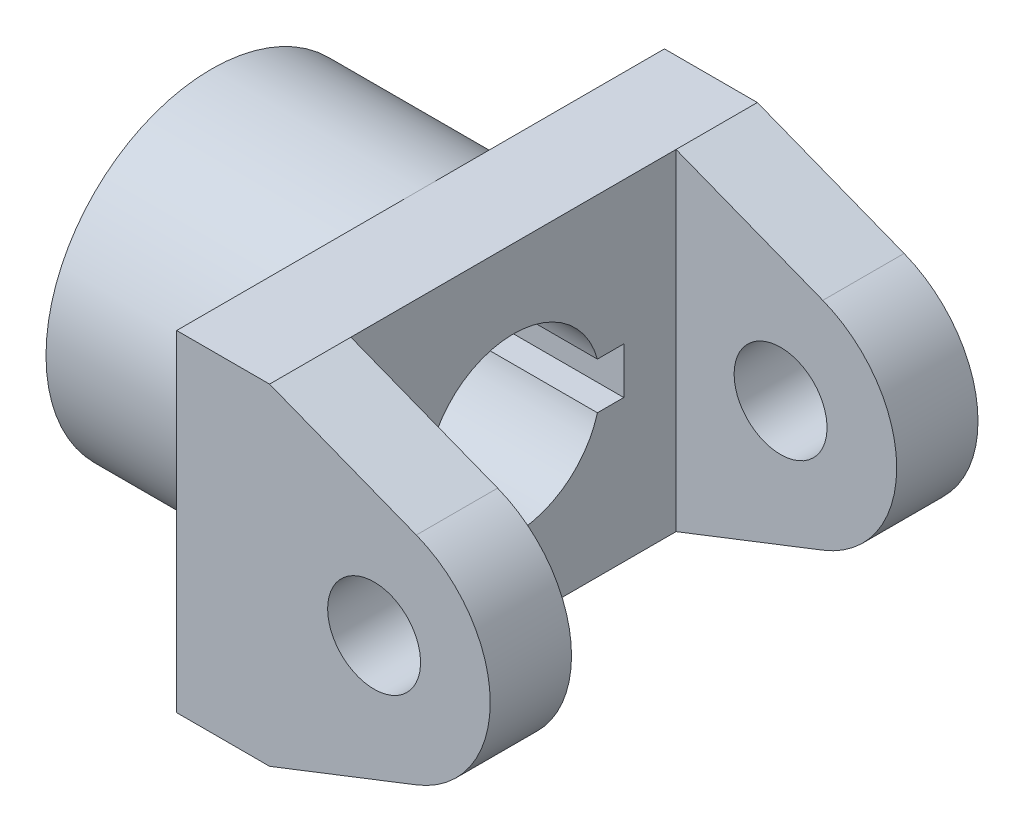
ISO-10303-21;
HEADER;
FILE_DESCRIPTION(('STEP AP214'),'2;1');
FILE_NAME('part.step','',(''),(''),'','','');
FILE_SCHEMA(('AUTOMOTIVE_DESIGN { 1 0 10303 214 1 1 1 1 }'));
ENDSEC;
DATA;
#1=APPLICATION_CONTEXT('core data for automotive mechanical design processes');
#2=APPLICATION_PROTOCOL_DEFINITION('international standard','automotive_design',2000,#1);
#3=PRODUCT_CONTEXT('',#1,'mechanical');
#4=PRODUCT('Part','Part','',(#3));
#5=PRODUCT_RELATED_PRODUCT_CATEGORY('part','',(#4));
#6=PRODUCT_DEFINITION_FORMATION('','',#4);
#7=PRODUCT_DEFINITION_CONTEXT('part definition',#1,'design');
#8=PRODUCT_DEFINITION('design','',#6,#7);
#9=PRODUCT_DEFINITION_SHAPE('','',#8);
#10=(LENGTH_UNIT() NAMED_UNIT(*) SI_UNIT(.MILLI.,.METRE.));
#11=(NAMED_UNIT(*) PLANE_ANGLE_UNIT() SI_UNIT($,.RADIAN.));
#12=(NAMED_UNIT(*) SI_UNIT($,.STERADIAN.) SOLID_ANGLE_UNIT());
#13=UNCERTAINTY_MEASURE_WITH_UNIT(LENGTH_MEASURE(1.E-05),#10,'distance_accuracy_value','');
#14=(GEOMETRIC_REPRESENTATION_CONTEXT(3) GLOBAL_UNCERTAINTY_ASSIGNED_CONTEXT((#13)) GLOBAL_UNIT_ASSIGNED_CONTEXT((#10,
#11,#12)) REPRESENTATION_CONTEXT('',''));
#15=CARTESIAN_POINT('',(0.,0.,0.));
#16=DIRECTION('',(0.,0.,1.));
#17=DIRECTION('',(1.,0.,0.));
#18=AXIS2_PLACEMENT_3D('',#15,#16,#17);
#19=CARTESIAN_POINT('',(-8.,28.5,42.));
#20=DIRECTION('',(1.,0.,0.));
#21=DIRECTION('',(0.,1.,0.));
#22=AXIS2_PLACEMENT_3D('',#19,#20,#21);
#23=PLANE('',#22);
#24=CARTESIAN_POINT('',(-8.,0.,0.));
#25=DIRECTION('',(-1.,0.,0.));
#26=DIRECTION('',(0.,-1.,0.));
#27=AXIS2_PLACEMENT_3D('',#24,#25,#26);
#28=CIRCLE('',#27,28.5);
#29=CARTESIAN_POINT('',(-7.99999999999999,-28.5,0.));
#30=VERTEX_POINT('',#29);
#31=CARTESIAN_POINT('',(-8.,28.5,0.));
#32=VERTEX_POINT('',#31);
#33=EDGE_CURVE('E177',#30,#32,#28,.T.);
#34=ORIENTED_EDGE('',*,*,#33,.F.);
#35=DIRECTION('',(0.,0.,-1.));
#36=VECTOR('',#35,1.);
#37=CARTESIAN_POINT('',(-7.99999999999999,-28.5,42.));
#38=LINE('',#37,#36);
#39=CARTESIAN_POINT('',(-7.99999999999999,-28.5,42.));
#40=VERTEX_POINT('',#39);
#41=EDGE_CURVE('E268',#40,#30,#38,.T.);
#42=ORIENTED_EDGE('',*,*,#41,.F.);
#43=DIRECTION('',(0.,-1.,0.));
#44=VECTOR('',#43,1.);
#45=CARTESIAN_POINT('',(-8.,28.5,42.));
#46=LINE('',#45,#44);
#47=CARTESIAN_POINT('',(-8.,28.5,42.));
#48=VERTEX_POINT('',#47);
#49=EDGE_CURVE('E251',#48,#40,#46,.T.);
#50=ORIENTED_EDGE('',*,*,#49,.F.);
#51=DIRECTION('',(0.,0.,-1.));
#52=VECTOR('',#51,1.);
#53=CARTESIAN_POINT('',(-8.,28.5,42.));
#54=LINE('',#53,#52);
#55=EDGE_CURVE('E271',#48,#32,#54,.T.);
#56=ORIENTED_EDGE('',*,*,#55,.T.);
#57=EDGE_LOOP('',(#34,#42,#50,#56));
#58=FACE_BOUND('',#57,.T.);
#59=ADVANCED_FACE('F41',(#58),#23,.F.);
#60=CARTESIAN_POINT('',(8.,28.5,42.));
#61=DIRECTION('',(-1.,0.,0.));
#62=DIRECTION('',(0.,-1.,0.));
#63=AXIS2_PLACEMENT_3D('',#60,#61,#62);
#64=PLANE('',#63);
#65=DIRECTION('',(0.,-1.,0.));
#66=VECTOR('',#65,1.);
#67=CARTESIAN_POINT('',(8.,28.5,-19.));
#68=LINE('',#67,#66);
#69=CARTESIAN_POINT('',(8.00000000000002,4.,-19.));
#70=VERTEX_POINT('',#69);
#71=CARTESIAN_POINT('',(8.00000000000002,-4.,-19.));
#72=VERTEX_POINT('',#71);
#73=EDGE_CURVE('E150',#70,#72,#68,.T.);
#74=ORIENTED_EDGE('',*,*,#73,.T.);
#75=DIRECTION('',(0.,0.,1.));
#76=VECTOR('',#75,1.);
#77=CARTESIAN_POINT('',(8.,-4.,42.));
#78=LINE('',#77,#76);
#79=CARTESIAN_POINT('',(8.00000000000001,-4.,-14.456832294801));
#80=VERTEX_POINT('',#79);
#81=EDGE_CURVE('E159',#72,#80,#78,.T.);
#82=ORIENTED_EDGE('',*,*,#81,.T.);
#83=CARTESIAN_POINT('',(8.,0.,0.));
#84=DIRECTION('',(-1.,0.,0.));
#85=DIRECTION('',(0.,-1.,0.));
#86=AXIS2_PLACEMENT_3D('',#83,#84,#85);
#87=CIRCLE('',#86,15.);
#88=CARTESIAN_POINT('',(8.,4.,-14.456832294801));
#89=VERTEX_POINT('',#88);
#90=EDGE_CURVE('E158',#80,#89,#87,.T.);
#91=ORIENTED_EDGE('',*,*,#90,.T.);
#92=DIRECTION('',(0.,0.,-1.));
#93=VECTOR('',#92,1.);
#94=CARTESIAN_POINT('',(8.,4.,42.));
#95=LINE('',#94,#93);
#96=EDGE_CURVE('E56',#89,#70,#95,.T.);
#97=ORIENTED_EDGE('',*,*,#96,.T.);
#98=EDGE_LOOP('',(#74,#82,#91,#97));
#99=FACE_BOUND('',#98,.T.);
#100=DIRECTION('',(0.,-1.,0.));
#101=VECTOR('',#100,1.);
#102=CARTESIAN_POINT('',(8.,0.,28.));
#103=LINE('',#102,#101);
#104=CARTESIAN_POINT('',(8.,28.5,28.));
#105=VERTEX_POINT('',#104);
#106=CARTESIAN_POINT('',(8.00000000000001,-28.5,28.));
#107=VERTEX_POINT('',#106);
#108=EDGE_CURVE('E191',#105,#107,#103,.T.);
#109=ORIENTED_EDGE('',*,*,#108,.T.);
#110=DIRECTION('',(0.,0.,-1.));
#111=VECTOR('',#110,1.);
#112=CARTESIAN_POINT('',(8.00000000000001,-28.5,42.));
#113=LINE('',#112,#111);
#114=CARTESIAN_POINT('',(8.00000000000001,-28.5,-28.));
#115=VERTEX_POINT('',#114);
#116=EDGE_CURVE('E257',#107,#115,#113,.T.);
#117=ORIENTED_EDGE('',*,*,#116,.T.);
#118=DIRECTION('',(0.,-1.,0.));
#119=VECTOR('',#118,1.);
#120=CARTESIAN_POINT('',(8.,0.,-28.));
#121=LINE('',#120,#119);
#122=CARTESIAN_POINT('',(8.,28.5,-28.));
#123=VERTEX_POINT('',#122);
#124=EDGE_CURVE('E226',#123,#115,#121,.T.);
#125=ORIENTED_EDGE('',*,*,#124,.F.);
#126=DIRECTION('',(0.,0.,-1.));
#127=VECTOR('',#126,1.);
#128=CARTESIAN_POINT('',(8.,28.5,42.));
#129=LINE('',#128,#127);
#130=EDGE_CURVE('E274',#105,#123,#129,.T.);
#131=ORIENTED_EDGE('',*,*,#130,.F.);
#132=EDGE_LOOP('',(#109,#117,#125,#131));
#133=FACE_BOUND('',#132,.T.);
#134=ADVANCED_FACE('F43',(#99,#133),#64,.F.);
#135=CARTESIAN_POINT('',(-8.,28.5,42.));
#136=DIRECTION('',(0.,-1.,0.));
#137=DIRECTION('',(0.,0.,-1.));
#138=AXIS2_PLACEMENT_3D('',#135,#136,#137);
#139=PLANE('',#138);
#140=DIRECTION('',(-1.,0.,0.));
#141=VECTOR('',#140,1.);
#142=CARTESIAN_POINT('',(-8.,28.5,-42.));
#143=LINE('',#142,#141);
#144=CARTESIAN_POINT('',(8.,28.5,-42.));
#145=VERTEX_POINT('',#144);
#146=CARTESIAN_POINT('',(-8.,28.5,-42.));
#147=VERTEX_POINT('',#146);
#148=EDGE_CURVE('E242',#145,#147,#143,.T.);
#149=ORIENTED_EDGE('',*,*,#148,.T.);
#150=EDGE_CURVE('E270',#32,#147,#54,.T.);
#151=ORIENTED_EDGE('',*,*,#150,.F.);
#152=ORIENTED_EDGE('',*,*,#55,.F.);
#153=DIRECTION('',(-1.,0.,0.));
#154=VECTOR('',#153,1.);
#155=CARTESIAN_POINT('',(-8.,28.5,42.));
#156=LINE('',#155,#154);
#157=CARTESIAN_POINT('',(8.,28.5,42.));
#158=VERTEX_POINT('',#157);
#159=EDGE_CURVE('E249',#158,#48,#156,.T.);
#160=ORIENTED_EDGE('',*,*,#159,.F.);
#161=EDGE_CURVE('E275',#158,#105,#129,.T.);
#162=ORIENTED_EDGE('',*,*,#161,.T.);
#163=ORIENTED_EDGE('',*,*,#130,.T.);
#164=DIRECTION('',(0.,0.,-1.));
#165=VECTOR('',#164,1.);
#166=CARTESIAN_POINT('',(8.,28.5,-28.));
#167=LINE('',#166,#165);
#168=EDGE_CURVE('E240',#123,#145,#167,.T.);
#169=ORIENTED_EDGE('',*,*,#168,.T.);
#170=EDGE_LOOP('',(#149,#151,#152,#160,#162,#163,#169));
#171=FACE_BOUND('',#170,.T.);
#172=ADVANCED_FACE('F308',(#171),#139,.F.);
#173=EDGE_CURVE('E64',#32,#30,#28,.T.);
#174=ORIENTED_EDGE('',*,*,#173,.F.);
#175=ORIENTED_EDGE('',*,*,#150,.T.);
#176=DIRECTION('',(0.,-1.,0.));
#177=VECTOR('',#176,1.);
#178=CARTESIAN_POINT('',(-8.,28.5,-42.));
#179=LINE('',#178,#177);
#180=CARTESIAN_POINT('',(-7.99999999999999,-28.5,-42.));
#181=VERTEX_POINT('',#180);
#182=EDGE_CURVE('E260',#147,#181,#179,.T.);
#183=ORIENTED_EDGE('',*,*,#182,.T.);
#184=EDGE_CURVE('E267',#30,#181,#38,.T.);
#185=ORIENTED_EDGE('',*,*,#184,.F.);
#186=EDGE_LOOP('',(#174,#175,#183,#185));
#187=FACE_BOUND('',#186,.T.);
#188=ADVANCED_FACE('F311',(#187),#23,.F.);
#189=CARTESIAN_POINT('',(-7.99999999999999,-28.5,42.));
#190=DIRECTION('',(0.,1.,0.));
#191=DIRECTION('',(0.,0.,1.));
#192=AXIS2_PLACEMENT_3D('',#189,#190,#191);
#193=PLANE('',#192);
#194=DIRECTION('',(1.,0.,0.));
#195=VECTOR('',#194,1.);
#196=CARTESIAN_POINT('',(-7.99999999999999,-28.5,-42.));
#197=LINE('',#196,#195);
#198=CARTESIAN_POINT('',(8.00000000000001,-28.5,-42.));
#199=VERTEX_POINT('',#198);
#200=EDGE_CURVE('E252',#181,#199,#197,.T.);
#201=ORIENTED_EDGE('',*,*,#200,.T.);
#202=DIRECTION('',(0.,0.,-1.));
#203=VECTOR('',#202,1.);
#204=CARTESIAN_POINT('',(8.00000000000001,-28.5,-28.));
#205=LINE('',#204,#203);
#206=EDGE_CURVE('E243',#115,#199,#205,.T.);
#207=ORIENTED_EDGE('',*,*,#206,.F.);
#208=ORIENTED_EDGE('',*,*,#116,.F.);
#209=CARTESIAN_POINT('',(8.00000000000001,-28.5,42.));
#210=VERTEX_POINT('',#209);
#211=EDGE_CURVE('E264',#210,#107,#113,.T.);
#212=ORIENTED_EDGE('',*,*,#211,.F.);
#213=DIRECTION('',(1.,0.,0.));
#214=VECTOR('',#213,1.);
#215=CARTESIAN_POINT('',(-7.99999999999999,-28.5,42.));
#216=LINE('',#215,#214);
#217=EDGE_CURVE('E254',#40,#210,#216,.T.);
#218=ORIENTED_EDGE('',*,*,#217,.F.);
#219=ORIENTED_EDGE('',*,*,#41,.T.);
#220=ORIENTED_EDGE('',*,*,#184,.T.);
#221=EDGE_LOOP('',(#201,#207,#208,#212,#218,#219,#220));
#222=FACE_BOUND('',#221,.T.);
#223=ADVANCED_FACE('F319',(#222),#193,.F.);
#224=CARTESIAN_POINT('',(0.,0.,42.));
#225=DIRECTION('',(0.,0.,1.));
#226=DIRECTION('',(1.,0.,0.));
#227=AXIS2_PLACEMENT_3D('',#224,#225,#226);
#228=PLANE('',#227);
#229=ORIENTED_EDGE('',*,*,#217,.T.);
#230=DIRECTION('',(-0.931494554757971,-0.363755267255677,0.));
#231=VECTOR('',#230,1.);
#232=CARTESIAN_POINT('',(10.715370600976,-27.4396284137025,42.));
#233=LINE('',#232,#231);
#234=CARTESIAN_POINT('',(33.2751053451135,-18.6298910951594,42.));
#235=VERTEX_POINT('',#234);
#236=EDGE_CURVE('E204',#235,#210,#233,.T.);
#237=ORIENTED_EDGE('',*,*,#236,.F.);
#238=CARTESIAN_POINT('',(26.,0.,42.));
#239=DIRECTION('',(0.,0.,-1.));
#240=DIRECTION('',(-1.,0.,0.));
#241=AXIS2_PLACEMENT_3D('',#238,#239,#240);
#242=CIRCLE('',#241,20.);
#243=CARTESIAN_POINT('',(33.2751053451135,18.6298910951594,42.));
#244=VERTEX_POINT('',#243);
#245=EDGE_CURVE('E188',#244,#235,#242,.T.);
#246=ORIENTED_EDGE('',*,*,#245,.F.);
#247=DIRECTION('',(-0.931494554757971,0.363755267255677,0.));
#248=VECTOR('',#247,1.);
#249=CARTESIAN_POINT('',(10.715370600976,27.4396284137025,42.));
#250=LINE('',#249,#248);
#251=EDGE_CURVE('E202',#244,#158,#250,.T.);
#252=ORIENTED_EDGE('',*,*,#251,.T.);
#253=ORIENTED_EDGE('',*,*,#159,.T.);
#254=ORIENTED_EDGE('',*,*,#49,.T.);
#255=EDGE_LOOP('',(#229,#237,#246,#252,#253,#254));
#256=FACE_BOUND('',#255,.T.);
#257=CARTESIAN_POINT('',(26.,0.,42.));
#258=DIRECTION('',(0.,0.,-1.));
#259=DIRECTION('',(-1.,0.,0.));
#260=AXIS2_PLACEMENT_3D('',#257,#258,#259);
#261=CIRCLE('',#260,8.);
#262=CARTESIAN_POINT('',(18.,0.,42.));
#263=VERTEX_POINT('',#262);
#264=EDGE_CURVE('E181',#263,#263,#261,.T.);
#265=ORIENTED_EDGE('',*,*,#264,.T.);
#266=EDGE_LOOP('',(#265));
#267=FACE_BOUND('',#266,.T.);
#268=ADVANCED_FACE('F344',(#256,#267),#228,.T.);
#269=CARTESIAN_POINT('',(0.,0.,-42.));
#270=DIRECTION('',(0.,0.,1.));
#271=DIRECTION('',(1.,0.,0.));
#272=AXIS2_PLACEMENT_3D('',#269,#270,#271);
#273=PLANE('',#272);
#274=ORIENTED_EDGE('',*,*,#148,.F.);
#275=DIRECTION('',(-0.931494554757971,0.363755267255677,0.));
#276=VECTOR('',#275,1.);
#277=CARTESIAN_POINT('',(10.715370600976,27.4396284137025,-42.));
#278=LINE('',#277,#276);
#279=CARTESIAN_POINT('',(33.2751053451135,18.6298910951594,-42.));
#280=VERTEX_POINT('',#279);
#281=EDGE_CURVE('E232',#280,#145,#278,.T.);
#282=ORIENTED_EDGE('',*,*,#281,.F.);
#283=CARTESIAN_POINT('',(26.,0.,-42.));
#284=DIRECTION('',(0.,0.,-1.));
#285=DIRECTION('',(-1.,0.,0.));
#286=AXIS2_PLACEMENT_3D('',#283,#284,#285);
#287=CIRCLE('',#286,20.);
#288=CARTESIAN_POINT('',(33.2751053451135,-18.6298910951594,-42.));
#289=VERTEX_POINT('',#288);
#290=EDGE_CURVE('E235',#280,#289,#287,.T.);
#291=ORIENTED_EDGE('',*,*,#290,.T.);
#292=DIRECTION('',(-0.931494554757971,-0.363755267255677,0.));
#293=VECTOR('',#292,1.);
#294=CARTESIAN_POINT('',(10.715370600976,-27.4396284137025,-42.));
#295=LINE('',#294,#293);
#296=EDGE_CURVE('E217',#289,#199,#295,.T.);
#297=ORIENTED_EDGE('',*,*,#296,.T.);
#298=ORIENTED_EDGE('',*,*,#200,.F.);
#299=ORIENTED_EDGE('',*,*,#182,.F.);
#300=EDGE_LOOP('',(#274,#282,#291,#297,#298,#299));
#301=FACE_BOUND('',#300,.T.);
#302=CARTESIAN_POINT('',(26.,0.,-42.));
#303=DIRECTION('',(0.,0.,-1.));
#304=DIRECTION('',(-1.,0.,0.));
#305=AXIS2_PLACEMENT_3D('',#302,#303,#304);
#306=CIRCLE('',#305,8.);
#307=CARTESIAN_POINT('',(18.,0.,-42.));
#308=VERTEX_POINT('',#307);
#309=EDGE_CURVE('E210',#308,#308,#306,.T.);
#310=ORIENTED_EDGE('',*,*,#309,.F.);
#311=EDGE_LOOP('',(#310));
#312=FACE_BOUND('',#311,.T.);
#313=ADVANCED_FACE('F314',(#301,#312),#273,.F.);
#314=CARTESIAN_POINT('',(10.715370600976,27.4396284137025,-28.));
#315=DIRECTION('',(-0.363755267255677,-0.931494554757971,0.));
#316=DIRECTION('',(0.931494554757971,-0.363755267255677,0.));
#317=AXIS2_PLACEMENT_3D('',#314,#315,#316);
#318=PLANE('',#317);
#319=ORIENTED_EDGE('',*,*,#281,.T.);
#320=ORIENTED_EDGE('',*,*,#168,.F.);
#321=DIRECTION('',(-0.931494554757971,0.363755267255677,0.));
#322=VECTOR('',#321,1.);
#323=CARTESIAN_POINT('',(10.715370600976,27.4396284137025,-28.));
#324=LINE('',#323,#322);
#325=CARTESIAN_POINT('',(33.2751053451135,18.6298910951594,-28.));
#326=VERTEX_POINT('',#325);
#327=EDGE_CURVE('E216',#326,#123,#324,.T.);
#328=ORIENTED_EDGE('',*,*,#327,.F.);
#329=DIRECTION('',(0.,0.,-1.));
#330=VECTOR('',#329,1.);
#331=CARTESIAN_POINT('',(33.2751053451135,18.6298910951594,-28.));
#332=LINE('',#331,#330);
#333=EDGE_CURVE('E229',#326,#280,#332,.T.);
#334=ORIENTED_EDGE('',*,*,#333,.T.);
#335=EDGE_LOOP('',(#319,#320,#328,#334));
#336=FACE_BOUND('',#335,.T.);
#337=ADVANCED_FACE('F335',(#336),#318,.F.);
#338=CARTESIAN_POINT('',(10.715370600976,-27.4396284137025,-28.));
#339=DIRECTION('',(0.363755267255677,-0.931494554757971,0.));
#340=DIRECTION('',(0.931494554757971,0.363755267255677,0.));
#341=AXIS2_PLACEMENT_3D('',#338,#339,#340);
#342=PLANE('',#341);
#343=ORIENTED_EDGE('',*,*,#296,.F.);
#344=DIRECTION('',(0.,0.,-1.));
#345=VECTOR('',#344,1.);
#346=CARTESIAN_POINT('',(33.2751053451135,-18.6298910951594,-28.));
#347=LINE('',#346,#345);
#348=CARTESIAN_POINT('',(33.2751053451135,-18.6298910951594,-28.));
#349=VERTEX_POINT('',#348);
#350=EDGE_CURVE('E246',#349,#289,#347,.T.);
#351=ORIENTED_EDGE('',*,*,#350,.F.);
#352=DIRECTION('',(-0.931494554757971,-0.363755267255677,0.));
#353=VECTOR('',#352,1.);
#354=CARTESIAN_POINT('',(10.715370600976,-27.4396284137025,-28.));
#355=LINE('',#354,#353);
#356=EDGE_CURVE('E223',#349,#115,#355,.T.);
#357=ORIENTED_EDGE('',*,*,#356,.T.);
#358=ORIENTED_EDGE('',*,*,#206,.T.);
#359=EDGE_LOOP('',(#343,#351,#357,#358));
#360=FACE_BOUND('',#359,.T.);
#361=ADVANCED_FACE('F322',(#360),#342,.T.);
#362=CARTESIAN_POINT('',(26.,0.,-28.));
#363=DIRECTION('',(0.,0.,-1.));
#364=DIRECTION('',(-1.,0.,0.));
#365=AXIS2_PLACEMENT_3D('',#362,#363,#364);
#366=CYLINDRICAL_SURFACE('',#365,8.);
#367=CARTESIAN_POINT('',(26.,0.,-28.));
#368=DIRECTION('',(0.,0.,-1.));
#369=DIRECTION('',(-1.,0.,0.));
#370=AXIS2_PLACEMENT_3D('',#367,#368,#369);
#371=CIRCLE('',#370,8.);
#372=CARTESIAN_POINT('',(18.,0.,-28.));
#373=VERTEX_POINT('',#372);
#374=EDGE_CURVE('E213',#373,#373,#371,.T.);
#375=ORIENTED_EDGE('',*,*,#374,.F.);
#376=EDGE_LOOP('',(#375));
#377=FACE_BOUND('',#376,.T.);
#378=ORIENTED_EDGE('',*,*,#309,.T.);
#379=EDGE_LOOP('',(#378));
#380=FACE_BOUND('',#379,.T.);
#381=ADVANCED_FACE('F448',(#377,#380),#366,.F.);
#382=CARTESIAN_POINT('',(26.,0.,-28.));
#383=DIRECTION('',(0.,0.,-1.));
#384=DIRECTION('',(-1.,0.,0.));
#385=AXIS2_PLACEMENT_3D('',#382,#383,#384);
#386=CYLINDRICAL_SURFACE('',#385,20.);
#387=ORIENTED_EDGE('',*,*,#290,.F.);
#388=ORIENTED_EDGE('',*,*,#333,.F.);
#389=CARTESIAN_POINT('',(26.,0.,-28.));
#390=DIRECTION('',(0.,0.,-1.));
#391=DIRECTION('',(-1.,0.,0.));
#392=AXIS2_PLACEMENT_3D('',#389,#390,#391);
#393=CIRCLE('',#392,20.);
#394=EDGE_CURVE('E220',#326,#349,#393,.T.);
#395=ORIENTED_EDGE('',*,*,#394,.T.);
#396=ORIENTED_EDGE('',*,*,#350,.T.);
#397=EDGE_LOOP('',(#387,#388,#395,#396));
#398=FACE_BOUND('',#397,.T.);
#399=ADVANCED_FACE('F330',(#398),#386,.T.);
#400=CARTESIAN_POINT('',(0.,0.,-28.));
#401=DIRECTION('',(0.,0.,-1.));
#402=DIRECTION('',(-1.,0.,0.));
#403=AXIS2_PLACEMENT_3D('',#400,#401,#402);
#404=PLANE('',#403);
#405=ORIENTED_EDGE('',*,*,#374,.T.);
#406=EDGE_LOOP('',(#405));
#407=FACE_BOUND('',#406,.T.);
#408=ORIENTED_EDGE('',*,*,#327,.T.);
#409=ORIENTED_EDGE('',*,*,#124,.T.);
#410=ORIENTED_EDGE('',*,*,#356,.F.);
#411=ORIENTED_EDGE('',*,*,#394,.F.);
#412=EDGE_LOOP('',(#408,#409,#410,#411));
#413=FACE_BOUND('',#412,.T.);
#414=ADVANCED_FACE('F326',(#407,#413),#404,.F.);
#415=CARTESIAN_POINT('',(10.715370600976,27.4396284137025,28.));
#416=DIRECTION('',(0.363755267255677,0.931494554757971,0.));
#417=DIRECTION('',(-0.931494554757971,0.363755267255677,0.));
#418=AXIS2_PLACEMENT_3D('',#415,#416,#417);
#419=PLANE('',#418);
#420=ORIENTED_EDGE('',*,*,#251,.F.);
#421=DIRECTION('',(0.,0.,1.));
#422=VECTOR('',#421,1.);
#423=CARTESIAN_POINT('',(33.2751053451135,18.6298910951594,28.));
#424=LINE('',#423,#422);
#425=CARTESIAN_POINT('',(33.2751053451135,18.6298910951594,28.));
#426=VERTEX_POINT('',#425);
#427=EDGE_CURVE('E208',#426,#244,#424,.T.);
#428=ORIENTED_EDGE('',*,*,#427,.F.);
#429=DIRECTION('',(-0.931494554757971,0.363755267255677,0.));
#430=VECTOR('',#429,1.);
#431=CARTESIAN_POINT('',(10.715370600976,27.4396284137025,28.));
#432=LINE('',#431,#430);
#433=EDGE_CURVE('E187',#426,#105,#432,.T.);
#434=ORIENTED_EDGE('',*,*,#433,.T.);
#435=ORIENTED_EDGE('',*,*,#161,.F.);
#436=EDGE_LOOP('',(#420,#428,#434,#435));
#437=FACE_BOUND('',#436,.T.);
#438=ADVANCED_FACE('F348',(#437),#419,.T.);
#439=CARTESIAN_POINT('',(26.,0.,28.));
#440=DIRECTION('',(0.,0.,1.));
#441=DIRECTION('',(1.,0.,0.));
#442=AXIS2_PLACEMENT_3D('',#439,#440,#441);
#443=CYLINDRICAL_SURFACE('',#442,20.);
#444=ORIENTED_EDGE('',*,*,#245,.T.);
#445=DIRECTION('',(0.,0.,1.));
#446=VECTOR('',#445,1.);
#447=CARTESIAN_POINT('',(33.2751053451135,-18.6298910951594,28.));
#448=LINE('',#447,#446);
#449=CARTESIAN_POINT('',(33.2751053451135,-18.6298910951594,28.));
#450=VERTEX_POINT('',#449);
#451=EDGE_CURVE('E199',#450,#235,#448,.T.);
#452=ORIENTED_EDGE('',*,*,#451,.F.);
#453=CARTESIAN_POINT('',(26.,0.,28.));
#454=DIRECTION('',(0.,0.,-1.));
#455=DIRECTION('',(-1.,0.,0.));
#456=AXIS2_PLACEMENT_3D('',#453,#454,#455);
#457=CIRCLE('',#456,20.);
#458=EDGE_CURVE('E196',#426,#450,#457,.T.);
#459=ORIENTED_EDGE('',*,*,#458,.F.);
#460=ORIENTED_EDGE('',*,*,#427,.T.);
#461=EDGE_LOOP('',(#444,#452,#459,#460));
#462=FACE_BOUND('',#461,.T.);
#463=ADVANCED_FACE('F353',(#462),#443,.T.);
#464=CARTESIAN_POINT('',(10.715370600976,-27.4396284137025,28.));
#465=DIRECTION('',(-0.363755267255677,0.931494554757971,0.));
#466=DIRECTION('',(-0.931494554757971,-0.363755267255677,0.));
#467=AXIS2_PLACEMENT_3D('',#464,#465,#466);
#468=PLANE('',#467);
#469=ORIENTED_EDGE('',*,*,#236,.T.);
#470=ORIENTED_EDGE('',*,*,#211,.T.);
#471=DIRECTION('',(-0.931494554757971,-0.363755267255677,0.));
#472=VECTOR('',#471,1.);
#473=CARTESIAN_POINT('',(10.715370600976,-27.4396284137025,28.));
#474=LINE('',#473,#472);
#475=EDGE_CURVE('E194',#450,#107,#474,.T.);
#476=ORIENTED_EDGE('',*,*,#475,.F.);
#477=ORIENTED_EDGE('',*,*,#451,.T.);
#478=EDGE_LOOP('',(#469,#470,#476,#477));
#479=FACE_BOUND('',#478,.T.);
#480=ADVANCED_FACE('F340',(#479),#468,.F.);
#481=CARTESIAN_POINT('',(26.,0.,28.));
#482=DIRECTION('',(0.,0.,1.));
#483=DIRECTION('',(1.,0.,0.));
#484=AXIS2_PLACEMENT_3D('',#481,#482,#483);
#485=CYLINDRICAL_SURFACE('',#484,8.);
#486=CARTESIAN_POINT('',(26.,0.,28.));
#487=DIRECTION('',(0.,0.,-1.));
#488=DIRECTION('',(-1.,0.,0.));
#489=AXIS2_PLACEMENT_3D('',#486,#487,#488);
#490=CIRCLE('',#489,8.);
#491=CARTESIAN_POINT('',(18.,0.,28.));
#492=VERTEX_POINT('',#491);
#493=EDGE_CURVE('E184',#492,#492,#490,.T.);
#494=ORIENTED_EDGE('',*,*,#493,.T.);
#495=EDGE_LOOP('',(#494));
#496=FACE_BOUND('',#495,.T.);
#497=ORIENTED_EDGE('',*,*,#264,.F.);
#498=EDGE_LOOP('',(#497));
#499=FACE_BOUND('',#498,.T.);
#500=ADVANCED_FACE('F360',(#496,#499),#485,.F.);
#501=CARTESIAN_POINT('',(0.,0.,28.));
#502=DIRECTION('',(0.,0.,1.));
#503=DIRECTION('',(-1.,0.,0.));
#504=AXIS2_PLACEMENT_3D('',#501,#502,#503);
#505=PLANE('',#504);
#506=ORIENTED_EDGE('',*,*,#493,.F.);
#507=EDGE_LOOP('',(#506));
#508=FACE_BOUND('',#507,.T.);
#509=ORIENTED_EDGE('',*,*,#433,.F.);
#510=ORIENTED_EDGE('',*,*,#458,.T.);
#511=ORIENTED_EDGE('',*,*,#475,.T.);
#512=ORIENTED_EDGE('',*,*,#108,.F.);
#513=EDGE_LOOP('',(#509,#510,#511,#512));
#514=FACE_BOUND('',#513,.T.);
#515=ADVANCED_FACE('F293',(#508,#514),#505,.F.);
#516=CARTESIAN_POINT('',(-44.,0.,0.));
#517=DIRECTION('',(-1.,0.,0.));
#518=DIRECTION('',(0.,-1.,0.));
#519=AXIS2_PLACEMENT_3D('',#516,#517,#518);
#520=PLANE('',#519);
#521=DIRECTION('',(0.,0.,1.));
#522=VECTOR('',#521,1.);
#523=CARTESIAN_POINT('',(-44.,-4.,0.));
#524=LINE('',#523,#522);
#525=CARTESIAN_POINT('',(-44.,-4.,-19.));
#526=VERTEX_POINT('',#525);
#527=CARTESIAN_POINT('',(-44.,-4.,-14.456832294801));
#528=VERTEX_POINT('',#527);
#529=EDGE_CURVE('E168',#526,#528,#524,.T.);
#530=ORIENTED_EDGE('',*,*,#529,.F.);
#531=DIRECTION('',(0.,-1.,0.));
#532=VECTOR('',#531,1.);
#533=CARTESIAN_POINT('',(-44.,0.,-19.));
#534=LINE('',#533,#532);
#535=CARTESIAN_POINT('',(-44.,3.99999999999999,-19.));
#536=VERTEX_POINT('',#535);
#537=EDGE_CURVE('E12',#536,#526,#534,.T.);
#538=ORIENTED_EDGE('',*,*,#537,.F.);
#539=DIRECTION('',(0.,0.,-1.));
#540=VECTOR('',#539,1.);
#541=CARTESIAN_POINT('',(-44.,3.99999999999999,0.));
#542=LINE('',#541,#540);
#543=CARTESIAN_POINT('',(-44.,3.99999999999999,-14.456832294801));
#544=VERTEX_POINT('',#543);
#545=EDGE_CURVE('E163',#544,#536,#542,.T.);
#546=ORIENTED_EDGE('',*,*,#545,.F.);
#547=CARTESIAN_POINT('',(-44.,0.,0.));
#548=DIRECTION('',(-1.,0.,0.));
#549=DIRECTION('',(0.,-1.,0.));
#550=AXIS2_PLACEMENT_3D('',#547,#548,#549);
#551=CIRCLE('',#550,15.);
#552=EDGE_CURVE('E174',#528,#544,#551,.T.);
#553=ORIENTED_EDGE('',*,*,#552,.F.);
#554=EDGE_LOOP('',(#530,#538,#546,#553));
#555=FACE_BOUND('',#554,.T.);
#556=CARTESIAN_POINT('',(-44.,0.,0.));
#557=DIRECTION('',(-1.,0.,0.));
#558=DIRECTION('',(0.,-1.,0.));
#559=AXIS2_PLACEMENT_3D('',#556,#557,#558);
#560=CIRCLE('',#559,28.5);
#561=CARTESIAN_POINT('',(-44.,-28.5,0.));
#562=VERTEX_POINT('',#561);
#563=EDGE_CURVE('E178',#562,#562,#560,.T.);
#564=ORIENTED_EDGE('',*,*,#563,.T.);
#565=EDGE_LOOP('',(#564));
#566=FACE_BOUND('',#565,.T.);
#567=ADVANCED_FACE('F288',(#555,#566),#520,.T.);
#568=CARTESIAN_POINT('',(-44.,0.,0.));
#569=DIRECTION('',(1.,0.,0.));
#570=DIRECTION('',(0.,1.,0.));
#571=AXIS2_PLACEMENT_3D('',#568,#569,#570);
#572=CYLINDRICAL_SURFACE('',#571,28.5);
#573=ORIENTED_EDGE('',*,*,#563,.F.);
#574=EDGE_LOOP('',(#573));
#575=FACE_BOUND('',#574,.T.);
#576=ORIENTED_EDGE('',*,*,#33,.T.);
#577=ORIENTED_EDGE('',*,*,#173,.T.);
#578=EDGE_LOOP('',(#576,#577));
#579=FACE_BOUND('',#578,.T.);
#580=ADVANCED_FACE('F292',(#575,#579),#572,.T.);
#581=CARTESIAN_POINT('',(-44.,0.,0.));
#582=DIRECTION('',(1.,0.,0.));
#583=DIRECTION('',(0.,1.,0.));
#584=AXIS2_PLACEMENT_3D('',#581,#582,#583);
#585=CYLINDRICAL_SURFACE('',#584,15.);
#586=DIRECTION('',(1.,0.,0.));
#587=VECTOR('',#586,1.);
#588=CARTESIAN_POINT('',(-44.,-4.,-14.456832294801));
#589=LINE('',#588,#587);
#590=EDGE_CURVE('E49',#528,#80,#589,.T.);
#591=ORIENTED_EDGE('',*,*,#590,.F.);
#592=ORIENTED_EDGE('',*,*,#552,.T.);
#593=DIRECTION('',(1.,0.,0.));
#594=VECTOR('',#593,1.);
#595=CARTESIAN_POINT('',(-44.,3.99999999999999,-14.456832294801));
#596=LINE('',#595,#594);
#597=EDGE_CURVE('E279',#89,#544,#596,.F.);
#598=ORIENTED_EDGE('',*,*,#597,.F.);
#599=ORIENTED_EDGE('',*,*,#90,.F.);
#600=EDGE_LOOP('',(#591,#592,#598,#599));
#601=FACE_BOUND('',#600,.T.);
#602=ADVANCED_FACE('F286',(#601),#585,.F.);
#603=CARTESIAN_POINT('',(46.,0.,-19.));
#604=DIRECTION('',(0.,0.,-1.));
#605=DIRECTION('',(0.,1.,0.));
#606=AXIS2_PLACEMENT_3D('',#603,#604,#605);
#607=PLANE('',#606);
#608=DIRECTION('',(-1.,0.,0.));
#609=VECTOR('',#608,1.);
#610=CARTESIAN_POINT('',(46.,4.,-19.));
#611=LINE('',#610,#609);
#612=EDGE_CURVE('E152',#70,#536,#611,.T.);
#613=ORIENTED_EDGE('',*,*,#612,.T.);
#614=ORIENTED_EDGE('',*,*,#537,.T.);
#615=DIRECTION('',(-1.,0.,0.));
#616=VECTOR('',#615,1.);
#617=CARTESIAN_POINT('',(46.,-4.,-19.));
#618=LINE('',#617,#616);
#619=EDGE_CURVE('E155',#72,#526,#618,.T.);
#620=ORIENTED_EDGE('',*,*,#619,.F.);
#621=ORIENTED_EDGE('',*,*,#73,.F.);
#622=EDGE_LOOP('',(#613,#614,#620,#621));
#623=FACE_BOUND('',#622,.T.);
#624=ADVANCED_FACE('F151',(#623),#607,.F.);
#625=CARTESIAN_POINT('',(46.,-4.,0.));
#626=DIRECTION('',(0.,-1.,0.));
#627=DIRECTION('',(1.,0.,0.));
#628=AXIS2_PLACEMENT_3D('',#625,#626,#627);
#629=PLANE('',#628);
#630=ORIENTED_EDGE('',*,*,#619,.T.);
#631=ORIENTED_EDGE('',*,*,#529,.T.);
#632=ORIENTED_EDGE('',*,*,#590,.T.);
#633=ORIENTED_EDGE('',*,*,#81,.F.);
#634=EDGE_LOOP('',(#630,#631,#632,#633));
#635=FACE_BOUND('',#634,.T.);
#636=ADVANCED_FACE('F282',(#635),#629,.F.);
#637=CARTESIAN_POINT('',(46.,4.,0.));
#638=DIRECTION('',(0.,1.,0.));
#639=DIRECTION('',(-1.,0.,0.));
#640=AXIS2_PLACEMENT_3D('',#637,#638,#639);
#641=PLANE('',#640);
#642=ORIENTED_EDGE('',*,*,#597,.T.);
#643=ORIENTED_EDGE('',*,*,#545,.T.);
#644=ORIENTED_EDGE('',*,*,#612,.F.);
#645=ORIENTED_EDGE('',*,*,#96,.F.);
#646=EDGE_LOOP('',(#642,#643,#644,#645));
#647=FACE_BOUND('',#646,.T.);
#648=ADVANCED_FACE('F161',(#647),#641,.F.);
#649=CLOSED_SHELL('',(#59,#134,#172,#188,#223,#268,#313,#337,#361,#381,#399,#414,#438,#463,#480,
#500,#515,#567,#580,#602,#624,#636,#648));
#650=MANIFOLD_SOLID_BREP('B2',#649);
#651=ADVANCED_BREP_SHAPE_REPRESENTATION('',(#18,#650),#14);
#652=SHAPE_DEFINITION_REPRESENTATION(#9,#651);
ENDSEC;
END-ISO-10303-21;
